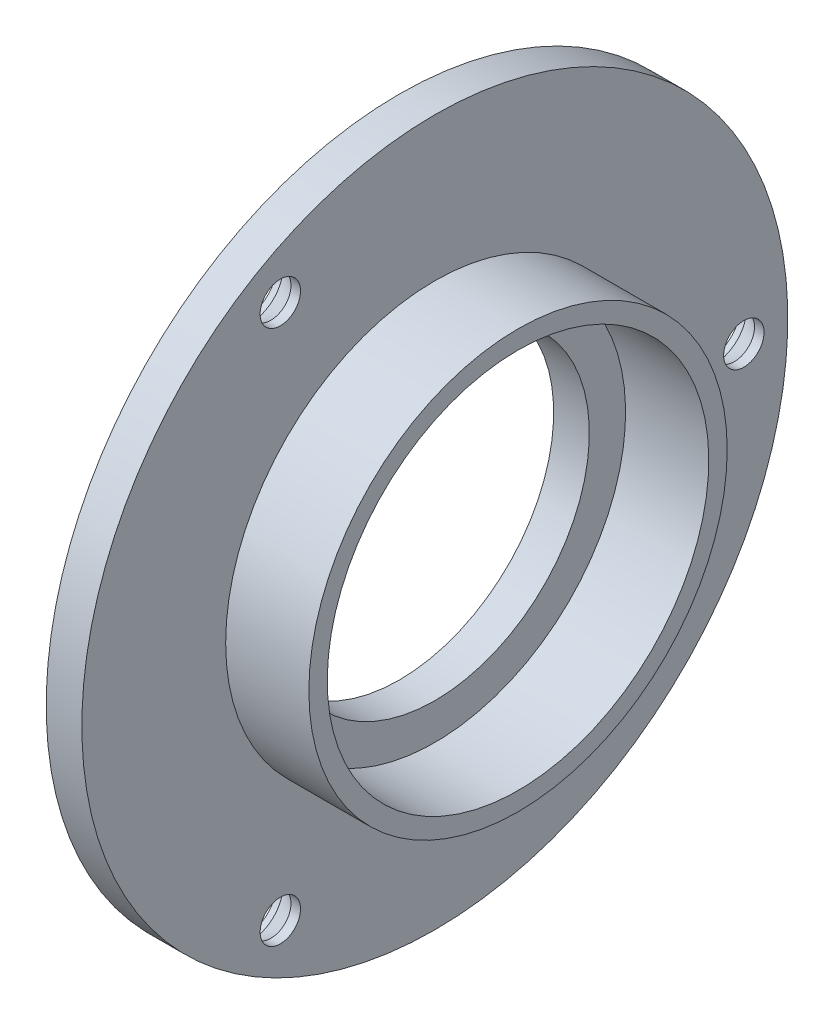
ISO-10303-21;
HEADER;
FILE_DESCRIPTION(('STEP AP214'),'2;1');
FILE_NAME('part.step','',(''),(''),'','','');
FILE_SCHEMA(('AUTOMOTIVE_DESIGN { 1 0 10303 214 1 1 1 1 }'));
ENDSEC;
DATA;
#1=APPLICATION_CONTEXT('core data for automotive mechanical design processes');
#2=APPLICATION_PROTOCOL_DEFINITION('international standard','automotive_design',2000,#1);
#3=PRODUCT_CONTEXT('',#1,'mechanical');
#4=PRODUCT('Part','Part','',(#3));
#5=PRODUCT_RELATED_PRODUCT_CATEGORY('part','',(#4));
#6=PRODUCT_DEFINITION_FORMATION('','',#4);
#7=PRODUCT_DEFINITION_CONTEXT('part definition',#1,'design');
#8=PRODUCT_DEFINITION('design','',#6,#7);
#9=PRODUCT_DEFINITION_SHAPE('','',#8);
#10=(LENGTH_UNIT() NAMED_UNIT(*) SI_UNIT(.MILLI.,.METRE.));
#11=(NAMED_UNIT(*) PLANE_ANGLE_UNIT() SI_UNIT($,.RADIAN.));
#12=(NAMED_UNIT(*) SI_UNIT($,.STERADIAN.) SOLID_ANGLE_UNIT());
#13=UNCERTAINTY_MEASURE_WITH_UNIT(LENGTH_MEASURE(1.E-05),#10,'distance_accuracy_value','');
#14=(GEOMETRIC_REPRESENTATION_CONTEXT(3) GLOBAL_UNCERTAINTY_ASSIGNED_CONTEXT((#13)) GLOBAL_UNIT_ASSIGNED_CONTEXT((#10,
#11,#12)) REPRESENTATION_CONTEXT('',''));
#15=CARTESIAN_POINT('',(0.,0.,0.));
#16=DIRECTION('',(0.,0.,1.));
#17=DIRECTION('',(1.,0.,0.));
#18=AXIS2_PLACEMENT_3D('',#15,#16,#17);
#19=CARTESIAN_POINT('',(-29.5,0.,0.));
#20=DIRECTION('',(1.,0.,0.));
#21=DIRECTION('',(0.,1.,0.));
#22=AXIS2_PLACEMENT_3D('',#19,#20,#21);
#23=PLANE('',#22);
#24=CARTESIAN_POINT('',(-29.5,0.,0.));
#25=DIRECTION('',(1.,0.,0.));
#26=DIRECTION('',(0.,1.,0.));
#27=AXIS2_PLACEMENT_3D('',#24,#25,#26);
#28=CIRCLE('',#27,16.05);
#29=CARTESIAN_POINT('',(-29.5,16.05,0.));
#30=VERTEX_POINT('',#29);
#31=EDGE_CURVE('E25',#30,#30,#28,.T.);
#32=ORIENTED_EDGE('',*,*,#31,.F.);
#33=EDGE_LOOP('',(#32));
#34=FACE_BOUND('',#33,.T.);
#35=CARTESIAN_POINT('',(-29.5,0.,0.));
#36=DIRECTION('',(1.,0.,0.));
#37=DIRECTION('',(0.,1.,0.));
#38=AXIS2_PLACEMENT_3D('',#35,#36,#37);
#39=CIRCLE('',#38,17.6);
#40=CARTESIAN_POINT('',(-29.5,17.6,0.));
#41=VERTEX_POINT('',#40);
#42=EDGE_CURVE('E164',#41,#41,#39,.T.);
#43=ORIENTED_EDGE('',*,*,#42,.T.);
#44=EDGE_LOOP('',(#43));
#45=FACE_BOUND('',#44,.T.);
#46=ADVANCED_FACE('F14',(#34,#45),#23,.T.);
#47=CARTESIAN_POINT('',(-29.5,0.,0.));
#48=DIRECTION('',(-1.,0.,0.));
#49=DIRECTION('',(0.,1.,0.));
#50=AXIS2_PLACEMENT_3D('',#47,#48,#49);
#51=CYLINDRICAL_SURFACE('',#50,16.05);
#52=ORIENTED_EDGE('',*,*,#31,.T.);
#53=DIRECTION('',(-1.,0.,0.));
#54=VECTOR('',#53,1.);
#55=CARTESIAN_POINT('',(-29.5,16.05,0.));
#56=LINE('',#55,#54);
#57=CARTESIAN_POINT('',(-36.5,16.05,0.));
#58=VERTEX_POINT('',#57);
#59=EDGE_CURVE('E9',#30,#58,#56,.T.);
#60=ORIENTED_EDGE('',*,*,#59,.T.);
#61=CARTESIAN_POINT('',(-36.5,0.,0.));
#62=DIRECTION('',(1.,0.,0.));
#63=DIRECTION('',(0.,1.,0.));
#64=AXIS2_PLACEMENT_3D('',#61,#62,#63);
#65=CIRCLE('',#64,16.05);
#66=EDGE_CURVE('E184',#58,#58,#65,.T.);
#67=ORIENTED_EDGE('',*,*,#66,.F.);
#68=ORIENTED_EDGE('',*,*,#59,.F.);
#69=EDGE_LOOP('',(#52,#60,#67,#68));
#70=FACE_BOUND('',#69,.T.);
#71=ADVANCED_FACE('F246',(#70),#51,.F.);
#72=CARTESIAN_POINT('',(-39.6,22.516660498395,13.));
#73=DIRECTION('',(1.,0.,0.));
#74=DIRECTION('',(0.,0.,-1.));
#75=AXIS2_PLACEMENT_3D('',#72,#73,#74);
#76=CYLINDRICAL_SURFACE('',#75,1.7);
#77=CARTESIAN_POINT('',(-37.3,22.516660498395,13.));
#78=DIRECTION('',(1.,0.,0.));
#79=DIRECTION('',(0.,0.,-1.));
#80=AXIS2_PLACEMENT_3D('',#77,#78,#79);
#81=CIRCLE('',#80,1.7);
#82=CARTESIAN_POINT('',(-37.3,22.516660498395,11.3));
#83=VERTEX_POINT('',#82);
#84=EDGE_CURVE('E176',#83,#83,#81,.T.);
#85=ORIENTED_EDGE('',*,*,#84,.F.);
#86=DIRECTION('',(1.,0.,0.));
#87=VECTOR('',#86,1.);
#88=CARTESIAN_POINT('',(-39.6,22.516660498395,11.3));
#89=LINE('',#88,#87);
#90=CARTESIAN_POINT('',(-36.5,22.516660498395,11.3));
#91=VERTEX_POINT('',#90);
#92=EDGE_CURVE('E167',#83,#91,#89,.T.);
#93=ORIENTED_EDGE('',*,*,#92,.T.);
#94=CARTESIAN_POINT('',(-36.5,22.516660498395,13.));
#95=DIRECTION('',(1.,0.,0.));
#96=DIRECTION('',(0.,0.,-1.));
#97=AXIS2_PLACEMENT_3D('',#94,#95,#96);
#98=CIRCLE('',#97,1.7);
#99=EDGE_CURVE('E197',#91,#91,#98,.T.);
#100=ORIENTED_EDGE('',*,*,#99,.T.);
#101=ORIENTED_EDGE('',*,*,#92,.F.);
#102=EDGE_LOOP('',(#85,#93,#100,#101));
#103=FACE_BOUND('',#102,.T.);
#104=ADVANCED_FACE('F281',(#103),#76,.F.);
#105=CARTESIAN_POINT('',(-36.5,0.,0.));
#106=DIRECTION('',(1.,0.,0.));
#107=DIRECTION('',(0.,1.,0.));
#108=AXIS2_PLACEMENT_3D('',#105,#106,#107);
#109=CYLINDRICAL_SURFACE('',#108,17.6);
#110=CARTESIAN_POINT('',(-36.5,0.,0.));
#111=DIRECTION('',(1.,0.,0.));
#112=DIRECTION('',(0.,1.,0.));
#113=AXIS2_PLACEMENT_3D('',#110,#111,#112);
#114=CIRCLE('',#113,17.6);
#115=CARTESIAN_POINT('',(-36.5,17.6,0.));
#116=VERTEX_POINT('',#115);
#117=EDGE_CURVE('E162',#116,#116,#114,.T.);
#118=ORIENTED_EDGE('',*,*,#117,.T.);
#119=DIRECTION('',(1.,0.,0.));
#120=VECTOR('',#119,1.);
#121=CARTESIAN_POINT('',(-36.5,17.6,0.));
#122=LINE('',#121,#120);
#123=EDGE_CURVE('E168',#116,#41,#122,.T.);
#124=ORIENTED_EDGE('',*,*,#123,.T.);
#125=ORIENTED_EDGE('',*,*,#42,.F.);
#126=ORIENTED_EDGE('',*,*,#123,.F.);
#127=EDGE_LOOP('',(#118,#124,#125,#126));
#128=FACE_BOUND('',#127,.T.);
#129=ADVANCED_FACE('F16',(#128),#109,.T.);
#130=CARTESIAN_POINT('',(-39.6,-22.51666049839,13.));
#131=DIRECTION('',(1.,0.,0.));
#132=DIRECTION('',(0.,0.,-1.));
#133=AXIS2_PLACEMENT_3D('',#130,#131,#132);
#134=CYLINDRICAL_SURFACE('',#133,1.7);
#135=CARTESIAN_POINT('',(-37.3,-22.51666049839,13.));
#136=DIRECTION('',(1.,0.,0.));
#137=DIRECTION('',(0.,0.,-1.));
#138=AXIS2_PLACEMENT_3D('',#135,#136,#137);
#139=CIRCLE('',#138,1.7);
#140=CARTESIAN_POINT('',(-37.3,-22.51666049839,11.3));
#141=VERTEX_POINT('',#140);
#142=EDGE_CURVE('E256',#141,#141,#139,.T.);
#143=ORIENTED_EDGE('',*,*,#142,.F.);
#144=DIRECTION('',(1.,0.,0.));
#145=VECTOR('',#144,1.);
#146=CARTESIAN_POINT('',(-39.6,-22.51666049839,11.3));
#147=LINE('',#146,#145);
#148=CARTESIAN_POINT('',(-36.5,-22.51666049839,11.3));
#149=VERTEX_POINT('',#148);
#150=EDGE_CURVE('E213',#141,#149,#147,.T.);
#151=ORIENTED_EDGE('',*,*,#150,.T.);
#152=CARTESIAN_POINT('',(-36.5,-22.51666049839,13.));
#153=DIRECTION('',(1.,0.,0.));
#154=DIRECTION('',(0.,0.,-1.));
#155=AXIS2_PLACEMENT_3D('',#152,#153,#154);
#156=CIRCLE('',#155,1.7);
#157=EDGE_CURVE('E158',#149,#149,#156,.T.);
#158=ORIENTED_EDGE('',*,*,#157,.T.);
#159=ORIENTED_EDGE('',*,*,#150,.F.);
#160=EDGE_LOOP('',(#143,#151,#158,#159));
#161=FACE_BOUND('',#160,.T.);
#162=ADVANCED_FACE('F296',(#161),#134,.F.);
#163=CARTESIAN_POINT('',(-39.6,0.,-26.));
#164=DIRECTION('',(1.,0.,0.));
#165=DIRECTION('',(0.,0.,-1.));
#166=AXIS2_PLACEMENT_3D('',#163,#164,#165);
#167=CYLINDRICAL_SURFACE('',#166,1.7);
#168=CARTESIAN_POINT('',(-37.3,0.,-26.));
#169=DIRECTION('',(1.,0.,0.));
#170=DIRECTION('',(0.,0.,-1.));
#171=AXIS2_PLACEMENT_3D('',#168,#169,#170);
#172=CIRCLE('',#171,1.7);
#173=CARTESIAN_POINT('',(-37.3,0.,-27.7));
#174=VERTEX_POINT('',#173);
#175=EDGE_CURVE('E177',#174,#174,#172,.T.);
#176=ORIENTED_EDGE('',*,*,#175,.F.);
#177=DIRECTION('',(1.,0.,0.));
#178=VECTOR('',#177,1.);
#179=CARTESIAN_POINT('',(-39.6,0.,-27.7));
#180=LINE('',#179,#178);
#181=CARTESIAN_POINT('',(-36.5,0.,-27.7));
#182=VERTEX_POINT('',#181);
#183=EDGE_CURVE('E18',#174,#182,#180,.T.);
#184=ORIENTED_EDGE('',*,*,#183,.T.);
#185=CARTESIAN_POINT('',(-36.5,0.,-26.));
#186=DIRECTION('',(1.,0.,0.));
#187=DIRECTION('',(0.,0.,-1.));
#188=AXIS2_PLACEMENT_3D('',#185,#186,#187);
#189=CIRCLE('',#188,1.7);
#190=EDGE_CURVE('E163',#182,#182,#189,.T.);
#191=ORIENTED_EDGE('',*,*,#190,.T.);
#192=ORIENTED_EDGE('',*,*,#183,.F.);
#193=EDGE_LOOP('',(#176,#184,#191,#192));
#194=FACE_BOUND('',#193,.T.);
#195=ADVANCED_FACE('F287',(#194),#167,.F.);
#196=CARTESIAN_POINT('',(-39.,-22.51666049839,13.));
#197=DIRECTION('',(-1.,0.,0.));
#198=DIRECTION('',(0.,0.,-1.));
#199=AXIS2_PLACEMENT_3D('',#196,#197,#198);
#200=CONICAL_SURFACE('',#199,2.75,0.553294325322);
#201=DIRECTION('',(0.850797997359174,0.,0.525492880722107));
#202=VECTOR('',#201,1.);
#203=CARTESIAN_POINT('',(-39.,-22.51666049839,10.25));
#204=LINE('',#203,#202);
#205=CARTESIAN_POINT('',(-39.,-22.51666049839,10.25));
#206=VERTEX_POINT('',#205);
#207=EDGE_CURVE('E201',#206,#141,#204,.T.);
#208=ORIENTED_EDGE('',*,*,#207,.F.);
#209=CARTESIAN_POINT('',(-39.,-22.51666049839,13.));
#210=DIRECTION('',(1.,0.,0.));
#211=DIRECTION('',(0.,0.,-1.));
#212=AXIS2_PLACEMENT_3D('',#209,#210,#211);
#213=CIRCLE('',#212,2.75);
#214=EDGE_CURVE('E130',#206,#206,#213,.T.);
#215=ORIENTED_EDGE('',*,*,#214,.F.);
#216=ORIENTED_EDGE('',*,*,#207,.T.);
#217=ORIENTED_EDGE('',*,*,#142,.T.);
#218=EDGE_LOOP('',(#208,#215,#216,#217));
#219=FACE_BOUND('',#218,.T.);
#220=ADVANCED_FACE('F244',(#219),#200,.F.);
#221=CARTESIAN_POINT('',(-36.5,0.,0.));
#222=DIRECTION('',(1.,0.,0.));
#223=DIRECTION('',(0.,1.,0.));
#224=AXIS2_PLACEMENT_3D('',#221,#222,#223);
#225=PLANE('',#224);
#226=CARTESIAN_POINT('',(-36.5,0.,0.));
#227=DIRECTION('',(1.,0.,0.));
#228=DIRECTION('',(0.,1.,0.));
#229=AXIS2_PLACEMENT_3D('',#226,#227,#228);
#230=CIRCLE('',#229,13.);
#231=CARTESIAN_POINT('',(-36.5,13.,0.));
#232=VERTEX_POINT('',#231);
#233=EDGE_CURVE('E207',#232,#232,#230,.T.);
#234=ORIENTED_EDGE('',*,*,#233,.F.);
#235=EDGE_LOOP('',(#234));
#236=FACE_BOUND('',#235,.T.);
#237=ORIENTED_EDGE('',*,*,#66,.T.);
#238=EDGE_LOOP('',(#237));
#239=FACE_BOUND('',#238,.T.);
#240=ADVANCED_FACE('F240',(#236,#239),#225,.T.);
#241=CARTESIAN_POINT('',(-39.,22.516660498395,13.));
#242=DIRECTION('',(-1.,0.,0.));
#243=DIRECTION('',(0.,0.,-1.));
#244=AXIS2_PLACEMENT_3D('',#241,#242,#243);
#245=CONICAL_SURFACE('',#244,2.75,0.553294325322);
#246=DIRECTION('',(0.850797997359174,0.,0.525492880722107));
#247=VECTOR('',#246,1.);
#248=CARTESIAN_POINT('',(-39.,22.516660498395,10.25));
#249=LINE('',#248,#247);
#250=CARTESIAN_POINT('',(-39.,22.516660498395,10.25));
#251=VERTEX_POINT('',#250);
#252=EDGE_CURVE('E173',#251,#83,#249,.T.);
#253=ORIENTED_EDGE('',*,*,#252,.F.);
#254=CARTESIAN_POINT('',(-39.,22.516660498395,13.));
#255=DIRECTION('',(1.,0.,0.));
#256=DIRECTION('',(0.,0.,-1.));
#257=AXIS2_PLACEMENT_3D('',#254,#255,#256);
#258=CIRCLE('',#257,2.75);
#259=EDGE_CURVE('E208',#251,#251,#258,.T.);
#260=ORIENTED_EDGE('',*,*,#259,.F.);
#261=ORIENTED_EDGE('',*,*,#252,.T.);
#262=ORIENTED_EDGE('',*,*,#84,.T.);
#263=EDGE_LOOP('',(#253,#260,#261,#262));
#264=FACE_BOUND('',#263,.T.);
#265=ADVANCED_FACE('F243',(#264),#245,.F.);
#266=CARTESIAN_POINT('',(-39.,0.,-26.));
#267=DIRECTION('',(-1.,0.,0.));
#268=DIRECTION('',(0.,0.,-1.));
#269=AXIS2_PLACEMENT_3D('',#266,#267,#268);
#270=CONICAL_SURFACE('',#269,2.75,0.553294325322);
#271=DIRECTION('',(0.850797997359174,0.,0.525492880722107));
#272=VECTOR('',#271,1.);
#273=CARTESIAN_POINT('',(-39.,0.,-28.75));
#274=LINE('',#273,#272);
#275=CARTESIAN_POINT('',(-39.,0.,-28.75));
#276=VERTEX_POINT('',#275);
#277=EDGE_CURVE('E188',#276,#174,#274,.T.);
#278=ORIENTED_EDGE('',*,*,#277,.F.);
#279=CARTESIAN_POINT('',(-39.,0.,-26.));
#280=DIRECTION('',(1.,0.,0.));
#281=DIRECTION('',(0.,0.,-1.));
#282=AXIS2_PLACEMENT_3D('',#279,#280,#281);
#283=CIRCLE('',#282,2.75);
#284=EDGE_CURVE('E152',#276,#276,#283,.T.);
#285=ORIENTED_EDGE('',*,*,#284,.F.);
#286=ORIENTED_EDGE('',*,*,#277,.T.);
#287=ORIENTED_EDGE('',*,*,#175,.T.);
#288=EDGE_LOOP('',(#278,#285,#286,#287));
#289=FACE_BOUND('',#288,.T.);
#290=ADVANCED_FACE('F263',(#289),#270,.F.);
#291=CARTESIAN_POINT('',(-36.5,0.,0.));
#292=DIRECTION('',(1.,0.,0.));
#293=DIRECTION('',(0.,1.,0.));
#294=AXIS2_PLACEMENT_3D('',#291,#292,#293);
#295=PLANE('',#294);
#296=ORIENTED_EDGE('',*,*,#99,.F.);
#297=EDGE_LOOP('',(#296));
#298=FACE_BOUND('',#297,.T.);
#299=ORIENTED_EDGE('',*,*,#117,.F.);
#300=EDGE_LOOP('',(#299));
#301=FACE_BOUND('',#300,.T.);
#302=ORIENTED_EDGE('',*,*,#157,.F.);
#303=EDGE_LOOP('',(#302));
#304=FACE_BOUND('',#303,.T.);
#305=ORIENTED_EDGE('',*,*,#190,.F.);
#306=EDGE_LOOP('',(#305));
#307=FACE_BOUND('',#306,.T.);
#308=CARTESIAN_POINT('',(-36.5,0.,0.));
#309=DIRECTION('',(1.,0.,0.));
#310=DIRECTION('',(0.,1.,0.));
#311=AXIS2_PLACEMENT_3D('',#308,#309,#310);
#312=CIRCLE('',#311,29.7);
#313=CARTESIAN_POINT('',(-36.5,29.7,0.));
#314=VERTEX_POINT('',#313);
#315=EDGE_CURVE('E144',#314,#314,#312,.T.);
#316=ORIENTED_EDGE('',*,*,#315,.T.);
#317=EDGE_LOOP('',(#316));
#318=FACE_BOUND('',#317,.T.);
#319=ADVANCED_FACE('F265',(#298,#301,#304,#307,#318),#295,.T.);
#320=CARTESIAN_POINT('',(-39.6,-22.51666049839,13.));
#321=DIRECTION('',(1.,0.,0.));
#322=DIRECTION('',(0.,0.,-1.));
#323=AXIS2_PLACEMENT_3D('',#320,#321,#322);
#324=CYLINDRICAL_SURFACE('',#323,2.75);
#325=CARTESIAN_POINT('',(-39.5,-22.51666049839,13.));
#326=DIRECTION('',(1.,0.,0.));
#327=DIRECTION('',(0.,0.,-1.));
#328=AXIS2_PLACEMENT_3D('',#325,#326,#327);
#329=CIRCLE('',#328,2.75);
#330=CARTESIAN_POINT('',(-39.5,-22.51666049839,10.25));
#331=VERTEX_POINT('',#330);
#332=EDGE_CURVE('E128',#331,#331,#329,.T.);
#333=ORIENTED_EDGE('',*,*,#332,.F.);
#334=DIRECTION('',(1.,0.,0.));
#335=VECTOR('',#334,1.);
#336=CARTESIAN_POINT('',(-39.6,-22.51666049839,10.25));
#337=LINE('',#336,#335);
#338=EDGE_CURVE('E125',#331,#206,#337,.T.);
#339=ORIENTED_EDGE('',*,*,#338,.T.);
#340=ORIENTED_EDGE('',*,*,#214,.T.);
#341=ORIENTED_EDGE('',*,*,#338,.F.);
#342=EDGE_LOOP('',(#333,#339,#340,#341));
#343=FACE_BOUND('',#342,.T.);
#344=ADVANCED_FACE('F127',(#343),#324,.F.);
#345=CARTESIAN_POINT('',(-36.5,0.,0.));
#346=DIRECTION('',(-1.,0.,0.));
#347=DIRECTION('',(0.,1.,0.));
#348=AXIS2_PLACEMENT_3D('',#345,#346,#347);
#349=CYLINDRICAL_SURFACE('',#348,13.);
#350=ORIENTED_EDGE('',*,*,#233,.T.);
#351=DIRECTION('',(-1.,0.,0.));
#352=VECTOR('',#351,1.);
#353=CARTESIAN_POINT('',(-36.5,13.,0.));
#354=LINE('',#353,#352);
#355=CARTESIAN_POINT('',(-39.5,13.,0.));
#356=VERTEX_POINT('',#355);
#357=EDGE_CURVE('E132',#232,#356,#354,.T.);
#358=ORIENTED_EDGE('',*,*,#357,.T.);
#359=CARTESIAN_POINT('',(-39.5,0.,0.));
#360=DIRECTION('',(1.,0.,0.));
#361=DIRECTION('',(0.,1.,0.));
#362=AXIS2_PLACEMENT_3D('',#359,#360,#361);
#363=CIRCLE('',#362,13.);
#364=EDGE_CURVE('E138',#356,#356,#363,.T.);
#365=ORIENTED_EDGE('',*,*,#364,.F.);
#366=ORIENTED_EDGE('',*,*,#357,.F.);
#367=EDGE_LOOP('',(#350,#358,#365,#366));
#368=FACE_BOUND('',#367,.T.);
#369=ADVANCED_FACE('F237',(#368),#349,.F.);
#370=CARTESIAN_POINT('',(-39.6,22.516660498395,13.));
#371=DIRECTION('',(1.,0.,0.));
#372=DIRECTION('',(0.,0.,-1.));
#373=AXIS2_PLACEMENT_3D('',#370,#371,#372);
#374=CYLINDRICAL_SURFACE('',#373,2.75);
#375=CARTESIAN_POINT('',(-39.5,22.516660498395,13.));
#376=DIRECTION('',(1.,0.,0.));
#377=DIRECTION('',(0.,0.,-1.));
#378=AXIS2_PLACEMENT_3D('',#375,#376,#377);
#379=CIRCLE('',#378,2.75);
#380=CARTESIAN_POINT('',(-39.5,22.516660498395,10.25));
#381=VERTEX_POINT('',#380);
#382=EDGE_CURVE('E148',#381,#381,#379,.T.);
#383=ORIENTED_EDGE('',*,*,#382,.F.);
#384=DIRECTION('',(1.,0.,0.));
#385=VECTOR('',#384,1.);
#386=CARTESIAN_POINT('',(-39.6,22.516660498395,10.25));
#387=LINE('',#386,#385);
#388=EDGE_CURVE('E212',#381,#251,#387,.T.);
#389=ORIENTED_EDGE('',*,*,#388,.T.);
#390=ORIENTED_EDGE('',*,*,#259,.T.);
#391=ORIENTED_EDGE('',*,*,#388,.F.);
#392=EDGE_LOOP('',(#383,#389,#390,#391));
#393=FACE_BOUND('',#392,.T.);
#394=ADVANCED_FACE('F292',(#393),#374,.F.);
#395=CARTESIAN_POINT('',(-39.6,0.,-26.));
#396=DIRECTION('',(1.,0.,0.));
#397=DIRECTION('',(0.,0.,-1.));
#398=AXIS2_PLACEMENT_3D('',#395,#396,#397);
#399=CYLINDRICAL_SURFACE('',#398,2.75);
#400=CARTESIAN_POINT('',(-39.5,0.,-26.));
#401=DIRECTION('',(1.,0.,0.));
#402=DIRECTION('',(0.,0.,-1.));
#403=AXIS2_PLACEMENT_3D('',#400,#401,#402);
#404=CIRCLE('',#403,2.75);
#405=CARTESIAN_POINT('',(-39.5,0.,-28.75));
#406=VERTEX_POINT('',#405);
#407=EDGE_CURVE('E153',#406,#406,#404,.T.);
#408=ORIENTED_EDGE('',*,*,#407,.F.);
#409=DIRECTION('',(1.,0.,0.));
#410=VECTOR('',#409,1.);
#411=CARTESIAN_POINT('',(-39.6,0.,-28.75));
#412=LINE('',#411,#410);
#413=EDGE_CURVE('E81',#406,#276,#412,.T.);
#414=ORIENTED_EDGE('',*,*,#413,.T.);
#415=ORIENTED_EDGE('',*,*,#284,.T.);
#416=ORIENTED_EDGE('',*,*,#413,.F.);
#417=EDGE_LOOP('',(#408,#414,#415,#416));
#418=FACE_BOUND('',#417,.T.);
#419=ADVANCED_FACE('F262',(#418),#399,.F.);
#420=CARTESIAN_POINT('',(-39.5,0.,0.));
#421=DIRECTION('',(1.,0.,0.));
#422=DIRECTION('',(0.,1.,0.));
#423=AXIS2_PLACEMENT_3D('',#420,#421,#422);
#424=CYLINDRICAL_SURFACE('',#423,29.7);
#425=CARTESIAN_POINT('',(-39.5,0.,0.));
#426=DIRECTION('',(1.,0.,0.));
#427=DIRECTION('',(0.,1.,0.));
#428=AXIS2_PLACEMENT_3D('',#425,#426,#427);
#429=CIRCLE('',#428,29.7);
#430=CARTESIAN_POINT('',(-39.5,29.7,0.));
#431=VERTEX_POINT('',#430);
#432=EDGE_CURVE('E155',#431,#431,#429,.T.);
#433=ORIENTED_EDGE('',*,*,#432,.T.);
#434=DIRECTION('',(1.,0.,0.));
#435=VECTOR('',#434,1.);
#436=CARTESIAN_POINT('',(-39.5,29.7,0.));
#437=LINE('',#436,#435);
#438=EDGE_CURVE('E72',#431,#314,#437,.T.);
#439=ORIENTED_EDGE('',*,*,#438,.T.);
#440=ORIENTED_EDGE('',*,*,#315,.F.);
#441=ORIENTED_EDGE('',*,*,#438,.F.);
#442=EDGE_LOOP('',(#433,#439,#440,#441));
#443=FACE_BOUND('',#442,.T.);
#444=ADVANCED_FACE('F291',(#443),#424,.T.);
#445=CARTESIAN_POINT('',(-39.5,0.,0.));
#446=DIRECTION('',(1.,0.,0.));
#447=DIRECTION('',(0.,1.,0.));
#448=AXIS2_PLACEMENT_3D('',#445,#446,#447);
#449=PLANE('',#448);
#450=ORIENTED_EDGE('',*,*,#332,.T.);
#451=EDGE_LOOP('',(#450));
#452=FACE_BOUND('',#451,.T.);
#453=ORIENTED_EDGE('',*,*,#364,.T.);
#454=EDGE_LOOP('',(#453));
#455=FACE_BOUND('',#454,.T.);
#456=ORIENTED_EDGE('',*,*,#382,.T.);
#457=EDGE_LOOP('',(#456));
#458=FACE_BOUND('',#457,.T.);
#459=ORIENTED_EDGE('',*,*,#407,.T.);
#460=EDGE_LOOP('',(#459));
#461=FACE_BOUND('',#460,.T.);
#462=ORIENTED_EDGE('',*,*,#432,.F.);
#463=EDGE_LOOP('',(#462));
#464=FACE_BOUND('',#463,.T.);
#465=ADVANCED_FACE('F135',(#452,#455,#458,#461,#464),#449,.F.);
#466=CLOSED_SHELL('',(#46,#71,#104,#129,#162,#195,#220,#240,#265,#290,#319,#344,#369,#394,#419,
#444,#465));
#467=MANIFOLD_SOLID_BREP('B1',#466);
#468=ADVANCED_BREP_SHAPE_REPRESENTATION('',(#18,#467),#14);
#469=SHAPE_DEFINITION_REPRESENTATION(#9,#468);
ENDSEC;
END-ISO-10303-21;
